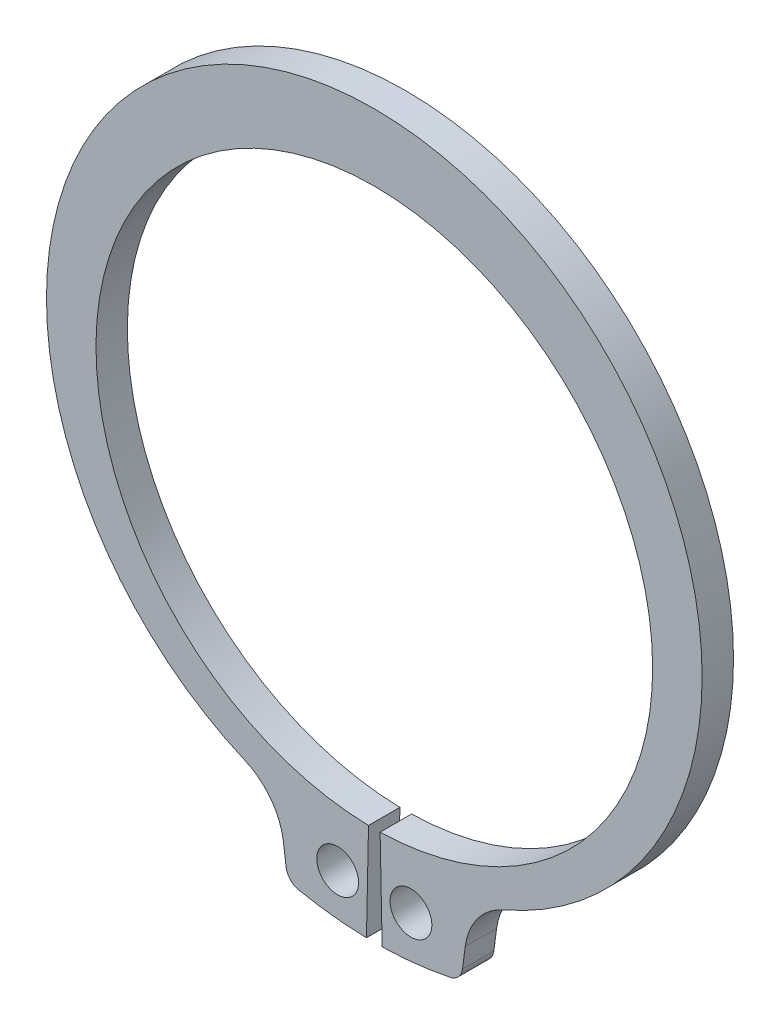
ISO-10303-21;
HEADER;
FILE_DESCRIPTION(('STEP AP214'),'2;1');
FILE_NAME('part.step','',(''),(''),'','','');
FILE_SCHEMA(('AUTOMOTIVE_DESIGN { 1 0 10303 214 1 1 1 1 }'));
ENDSEC;
DATA;
#1=APPLICATION_CONTEXT('core data for automotive mechanical design processes');
#2=APPLICATION_PROTOCOL_DEFINITION('international standard','automotive_design',2000,#1);
#3=PRODUCT_CONTEXT('',#1,'mechanical');
#4=PRODUCT('Part','Part','',(#3));
#5=PRODUCT_RELATED_PRODUCT_CATEGORY('part','',(#4));
#6=PRODUCT_DEFINITION_FORMATION('','',#4);
#7=PRODUCT_DEFINITION_CONTEXT('part definition',#1,'design');
#8=PRODUCT_DEFINITION('design','',#6,#7);
#9=PRODUCT_DEFINITION_SHAPE('','',#8);
#10=(LENGTH_UNIT() NAMED_UNIT(*) SI_UNIT(.MILLI.,.METRE.));
#11=(NAMED_UNIT(*) PLANE_ANGLE_UNIT() SI_UNIT($,.RADIAN.));
#12=(NAMED_UNIT(*) SI_UNIT($,.STERADIAN.) SOLID_ANGLE_UNIT());
#13=UNCERTAINTY_MEASURE_WITH_UNIT(LENGTH_MEASURE(1.E-05),#10,'distance_accuracy_value','');
#14=(GEOMETRIC_REPRESENTATION_CONTEXT(3) GLOBAL_UNCERTAINTY_ASSIGNED_CONTEXT((#13)) GLOBAL_UNIT_ASSIGNED_CONTEXT((#10,
#11,#12)) REPRESENTATION_CONTEXT('',''));
#15=CARTESIAN_POINT('',(0.,0.,0.));
#16=DIRECTION('',(0.,0.,1.));
#17=DIRECTION('',(1.,0.,0.));
#18=AXIS2_PLACEMENT_3D('',#15,#16,#17);
#19=CARTESIAN_POINT('',(0.,0.,-1.5));
#20=DIRECTION('',(0.,0.,1.));
#21=DIRECTION('',(1.,0.,0.));
#22=AXIS2_PLACEMENT_3D('',#19,#20,#21);
#23=CYLINDRICAL_SURFACE('',#22,13.3);
#24=CARTESIAN_POINT('',(0.,0.,0.));
#25=DIRECTION('',(0.,0.,-1.));
#26=DIRECTION('',(1.,0.,0.));
#27=AXIS2_PLACEMENT_3D('',#24,#25,#26);
#28=CIRCLE('',#27,13.3);
#29=CARTESIAN_POINT('',(-0.277083333333333,-13.2971134020279,0.));
#30=VERTEX_POINT('',#29);
#31=CARTESIAN_POINT('',(0.277083333333333,-13.2971134020279,0.));
#32=VERTEX_POINT('',#31);
#33=EDGE_CURVE('E153',#30,#32,#28,.T.);
#34=ORIENTED_EDGE('',*,*,#33,.F.);
#35=DIRECTION('',(0.,0.,1.));
#36=VECTOR('',#35,1.);
#37=CARTESIAN_POINT('',(-0.277083333333333,-13.2971134020279,-1.5));
#38=LINE('',#37,#36);
#39=CARTESIAN_POINT('',(-0.277083333333333,-13.2971134020279,-1.5));
#40=VERTEX_POINT('',#39);
#41=EDGE_CURVE('E11',#40,#30,#38,.T.);
#42=ORIENTED_EDGE('',*,*,#41,.F.);
#43=CARTESIAN_POINT('',(0.,0.,-1.5));
#44=DIRECTION('',(0.,0.,-1.));
#45=DIRECTION('',(1.,0.,0.));
#46=AXIS2_PLACEMENT_3D('',#43,#44,#45);
#47=CIRCLE('',#46,13.3);
#48=CARTESIAN_POINT('',(0.277083333333333,-13.2971134020279,-1.5));
#49=VERTEX_POINT('',#48);
#50=EDGE_CURVE('E186',#40,#49,#47,.T.);
#51=ORIENTED_EDGE('',*,*,#50,.T.);
#52=DIRECTION('',(0.,0.,1.));
#53=VECTOR('',#52,1.);
#54=CARTESIAN_POINT('',(0.277083333333333,-13.2971134020279,-1.5));
#55=LINE('',#54,#53);
#56=EDGE_CURVE('E35',#49,#32,#55,.T.);
#57=ORIENTED_EDGE('',*,*,#56,.T.);
#58=EDGE_LOOP('',(#34,#42,#51,#57));
#59=FACE_BOUND('',#58,.T.);
#60=ADVANCED_FACE('F32',(#59),#23,.F.);
#61=CARTESIAN_POINT('',(-0.277083333333333,-13.2971134020279,-1.5));
#62=DIRECTION('',(0.999782962558486,-0.0208333333333333,0.));
#63=DIRECTION('',(0.0208333333333333,0.999782962558486,0.));
#64=AXIS2_PLACEMENT_3D('',#61,#62,#63);
#65=PLANE('',#64);
#66=DIRECTION('',(0.0208333333333333,0.999782962558486,0.));
#67=VECTOR('',#66,1.);
#68=CARTESIAN_POINT('',(-0.277083333333333,-13.2971134020279,0.));
#69=LINE('',#68,#67);
#70=CARTESIAN_POINT('',(-0.375,-17.9960933260527,0.));
#71=VERTEX_POINT('',#70);
#72=EDGE_CURVE('E184',#71,#30,#69,.T.);
#73=ORIENTED_EDGE('',*,*,#72,.F.);
#74=DIRECTION('',(0.,0.,1.));
#75=VECTOR('',#74,1.);
#76=CARTESIAN_POINT('',(-0.375,-17.9960933260527,-1.5));
#77=LINE('',#76,#75);
#78=CARTESIAN_POINT('',(-0.375,-17.9960933260527,-1.5));
#79=VERTEX_POINT('',#78);
#80=EDGE_CURVE('E41',#79,#71,#77,.T.);
#81=ORIENTED_EDGE('',*,*,#80,.F.);
#82=DIRECTION('',(0.0208333333333333,0.999782962558486,0.));
#83=VECTOR('',#82,1.);
#84=CARTESIAN_POINT('',(-0.277083333333333,-13.2971134020279,-1.5));
#85=LINE('',#84,#83);
#86=EDGE_CURVE('E143',#79,#40,#85,.T.);
#87=ORIENTED_EDGE('',*,*,#86,.T.);
#88=ORIENTED_EDGE('',*,*,#41,.T.);
#89=EDGE_LOOP('',(#73,#81,#87,#88));
#90=FACE_BOUND('',#89,.T.);
#91=ADVANCED_FACE('F206',(#90),#65,.T.);
#92=CARTESIAN_POINT('',(0.,0.,-1.5));
#93=DIRECTION('',(0.,0.,1.));
#94=DIRECTION('',(1.,0.,0.));
#95=AXIS2_PLACEMENT_3D('',#92,#93,#94);
#96=CYLINDRICAL_SURFACE('',#95,18.);
#97=CARTESIAN_POINT('',(0.,0.,0.));
#98=DIRECTION('',(0.,0.,1.));
#99=DIRECTION('',(1.,0.,0.));
#100=AXIS2_PLACEMENT_3D('',#97,#98,#99);
#101=CIRCLE('',#100,18.);
#102=CARTESIAN_POINT('',(-3.62084439856544,-17.6320584686354,0.));
#103=VERTEX_POINT('',#102);
#104=EDGE_CURVE('E130',#103,#71,#101,.T.);
#105=ORIENTED_EDGE('',*,*,#104,.F.);
#106=DIRECTION('',(0.,0.,1.));
#107=VECTOR('',#106,1.);
#108=CARTESIAN_POINT('',(-3.62084439856544,-17.6320584686354,-1.5));
#109=LINE('',#108,#107);
#110=CARTESIAN_POINT('',(-3.62084439856544,-17.6320584686354,-1.5));
#111=VERTEX_POINT('',#110);
#112=EDGE_CURVE('E125',#111,#103,#109,.T.);
#113=ORIENTED_EDGE('',*,*,#112,.F.);
#114=CARTESIAN_POINT('',(0.,0.,-1.5));
#115=DIRECTION('',(0.,0.,1.));
#116=DIRECTION('',(1.,0.,0.));
#117=AXIS2_PLACEMENT_3D('',#114,#115,#116);
#118=CIRCLE('',#117,18.);
#119=EDGE_CURVE('E128',#111,#79,#118,.T.);
#120=ORIENTED_EDGE('',*,*,#119,.T.);
#121=ORIENTED_EDGE('',*,*,#80,.T.);
#122=EDGE_LOOP('',(#105,#113,#120,#121));
#123=FACE_BOUND('',#122,.T.);
#124=ADVANCED_FACE('F127',(#123),#96,.T.);
#125=CARTESIAN_POINT('',(-3.46997588195855,-16.8973893657756,-1.5));
#126=DIRECTION('',(0.,0.,1.));
#127=DIRECTION('',(1.,0.,0.));
#128=AXIS2_PLACEMENT_3D('',#125,#126,#127);
#129=CYLINDRICAL_SURFACE('',#128,0.75);
#130=CARTESIAN_POINT('',(-3.46997588195855,-16.8973893657756,0.));
#131=DIRECTION('',(0.,0.,1.));
#132=DIRECTION('',(1.,0.,0.));
#133=AXIS2_PLACEMENT_3D('',#130,#131,#132);
#134=CIRCLE('',#133,0.75);
#135=CARTESIAN_POINT('',(-4.21355952798891,-16.9952840099406,0.));
#136=VERTEX_POINT('',#135);
#137=EDGE_CURVE('E181',#136,#103,#134,.T.);
#138=ORIENTED_EDGE('',*,*,#137,.F.);
#139=DIRECTION('',(0.,0.,1.));
#140=VECTOR('',#139,1.);
#141=CARTESIAN_POINT('',(-4.21355952798891,-16.9952840099406,-1.5));
#142=LINE('',#141,#140);
#143=CARTESIAN_POINT('',(-4.21355952798891,-16.9952840099406,-1.5));
#144=VERTEX_POINT('',#143);
#145=EDGE_CURVE('E135',#144,#136,#142,.T.);
#146=ORIENTED_EDGE('',*,*,#145,.F.);
#147=CARTESIAN_POINT('',(-3.46997588195855,-16.8973893657756,-1.5));
#148=DIRECTION('',(0.,0.,1.));
#149=DIRECTION('',(1.,0.,0.));
#150=AXIS2_PLACEMENT_3D('',#147,#148,#149);
#151=CIRCLE('',#150,0.75);
#152=EDGE_CURVE('E141',#144,#111,#151,.T.);
#153=ORIENTED_EDGE('',*,*,#152,.T.);
#154=ORIENTED_EDGE('',*,*,#112,.T.);
#155=EDGE_LOOP('',(#138,#146,#153,#154));
#156=FACE_BOUND('',#155,.T.);
#157=ADVANCED_FACE('F145',(#156),#129,.T.);
#158=CARTESIAN_POINT('',(-4.34513661308763,-15.9958568246616,-1.5));
#159=DIRECTION('',(-0.99144486137381,-0.130526192220052,0.));
#160=DIRECTION('',(0.130526192220052,-0.99144486137381,0.));
#161=AXIS2_PLACEMENT_3D('',#158,#159,#160);
#162=PLANE('',#161);
#163=DIRECTION('',(0.130526192220052,-0.99144486137381,0.));
#164=VECTOR('',#163,1.);
#165=CARTESIAN_POINT('',(-4.34513661308763,-15.9958568246616,0.));
#166=LINE('',#165,#164);
#167=CARTESIAN_POINT('',(-4.34513661308763,-15.9958568246616,0.));
#168=VERTEX_POINT('',#167);
#169=EDGE_CURVE('E178',#168,#136,#166,.T.);
#170=ORIENTED_EDGE('',*,*,#169,.F.);
#171=DIRECTION('',(0.,0.,1.));
#172=VECTOR('',#171,1.);
#173=CARTESIAN_POINT('',(-4.34513661308763,-15.9958568246616,-1.5));
#174=LINE('',#173,#172);
#175=CARTESIAN_POINT('',(-4.34513661308763,-15.9958568246616,-1.5));
#176=VERTEX_POINT('',#175);
#177=EDGE_CURVE('E190',#176,#168,#174,.T.);
#178=ORIENTED_EDGE('',*,*,#177,.F.);
#179=DIRECTION('',(0.130526192220052,-0.99144486137381,0.));
#180=VECTOR('',#179,1.);
#181=CARTESIAN_POINT('',(-4.34513661308763,-15.9958568246616,-1.5));
#182=LINE('',#181,#180);
#183=EDGE_CURVE('E146',#176,#144,#182,.T.);
#184=ORIENTED_EDGE('',*,*,#183,.T.);
#185=ORIENTED_EDGE('',*,*,#145,.T.);
#186=EDGE_LOOP('',(#170,#178,#184,#185));
#187=FACE_BOUND('',#186,.T.);
#188=ADVANCED_FACE('F219',(#187),#162,.T.);
#189=CARTESIAN_POINT('',(-7.41799621001931,-16.4004064653331,-1.5));
#190=DIRECTION('',(0.,0.,1.));
#191=DIRECTION('',(1.,0.,0.));
#192=AXIS2_PLACEMENT_3D('',#189,#190,#191);
#193=CYLINDRICAL_SURFACE('',#192,3.09937518126195);
#194=CARTESIAN_POINT('',(-7.41799621001931,-16.4004064653331,0.));
#195=DIRECTION('',(0.,0.,-1.));
#196=DIRECTION('',(1.,0.,0.));
#197=AXIS2_PLACEMENT_3D('',#194,#195,#196);
#198=CIRCLE('',#197,3.09937518126195);
#199=CARTESIAN_POINT('',(-6.19272634443664,-13.5535063492915,0.));
#200=VERTEX_POINT('',#199);
#201=EDGE_CURVE('E175',#200,#168,#198,.T.);
#202=ORIENTED_EDGE('',*,*,#201,.F.);
#203=DIRECTION('',(0.,0.,1.));
#204=VECTOR('',#203,1.);
#205=CARTESIAN_POINT('',(-6.19272634443664,-13.5535063492915,-1.5));
#206=LINE('',#205,#204);
#207=CARTESIAN_POINT('',(-6.19272634443664,-13.5535063492915,-1.5));
#208=VERTEX_POINT('',#207);
#209=EDGE_CURVE('E192',#208,#200,#206,.T.);
#210=ORIENTED_EDGE('',*,*,#209,.F.);
#211=CARTESIAN_POINT('',(-7.41799621001931,-16.4004064653331,-1.5));
#212=DIRECTION('',(0.,0.,-1.));
#213=DIRECTION('',(1.,0.,0.));
#214=AXIS2_PLACEMENT_3D('',#211,#212,#213);
#215=CIRCLE('',#214,3.09937518126195);
#216=EDGE_CURVE('E148',#208,#176,#215,.T.);
#217=ORIENTED_EDGE('',*,*,#216,.T.);
#218=ORIENTED_EDGE('',*,*,#177,.T.);
#219=EDGE_LOOP('',(#202,#210,#217,#218));
#220=FACE_BOUND('',#219,.T.);
#221=ADVANCED_FACE('F222',(#220),#193,.F.);
#222=CARTESIAN_POINT('',(0.,0.835220447810059,-1.5));
#223=DIRECTION('',(0.,0.,1.));
#224=DIRECTION('',(1.,0.,0.));
#225=AXIS2_PLACEMENT_3D('',#222,#223,#224);
#226=CYLINDRICAL_SURFACE('',#225,15.6647795521899);
#227=CARTESIAN_POINT('',(0.,0.835220447810059,0.));
#228=DIRECTION('',(0.,0.,1.));
#229=DIRECTION('',(1.,0.,0.));
#230=AXIS2_PLACEMENT_3D('',#227,#228,#229);
#231=CIRCLE('',#230,15.6647795521899);
#232=CARTESIAN_POINT('',(6.19272634443663,-13.5535063492915,0.));
#233=VERTEX_POINT('',#232);
#234=EDGE_CURVE('E172',#233,#200,#231,.T.);
#235=ORIENTED_EDGE('',*,*,#234,.F.);
#236=DIRECTION('',(0.,0.,1.));
#237=VECTOR('',#236,1.);
#238=CARTESIAN_POINT('',(6.19272634443663,-13.5535063492915,-1.5));
#239=LINE('',#238,#237);
#240=CARTESIAN_POINT('',(6.19272634443663,-13.5535063492915,-1.5));
#241=VERTEX_POINT('',#240);
#242=EDGE_CURVE('E194',#241,#233,#239,.T.);
#243=ORIENTED_EDGE('',*,*,#242,.F.);
#244=CARTESIAN_POINT('',(0.,0.835220447810059,-1.5));
#245=DIRECTION('',(0.,0.,1.));
#246=DIRECTION('',(1.,0.,0.));
#247=AXIS2_PLACEMENT_3D('',#244,#245,#246);
#248=CIRCLE('',#247,15.6647795521899);
#249=EDGE_CURVE('E296',#241,#208,#248,.T.);
#250=ORIENTED_EDGE('',*,*,#249,.T.);
#251=ORIENTED_EDGE('',*,*,#209,.T.);
#252=EDGE_LOOP('',(#235,#243,#250,#251));
#253=FACE_BOUND('',#252,.T.);
#254=ADVANCED_FACE('F226',(#253),#226,.T.);
#255=CARTESIAN_POINT('',(7.41799621001931,-16.4004064653331,-1.5));
#256=DIRECTION('',(0.,0.,1.));
#257=DIRECTION('',(1.,0.,0.));
#258=AXIS2_PLACEMENT_3D('',#255,#256,#257);
#259=CYLINDRICAL_SURFACE('',#258,3.09937518126195);
#260=CARTESIAN_POINT('',(7.41799621001931,-16.4004064653331,0.));
#261=DIRECTION('',(0.,0.,-1.));
#262=DIRECTION('',(1.,0.,0.));
#263=AXIS2_PLACEMENT_3D('',#260,#261,#262);
#264=CIRCLE('',#263,3.09937518126195);
#265=CARTESIAN_POINT('',(4.34513661308763,-15.9958568246616,0.));
#266=VERTEX_POINT('',#265);
#267=EDGE_CURVE('E169',#266,#233,#264,.T.);
#268=ORIENTED_EDGE('',*,*,#267,.F.);
#269=DIRECTION('',(0.,0.,1.));
#270=VECTOR('',#269,1.);
#271=CARTESIAN_POINT('',(4.34513661308763,-15.9958568246616,-1.5));
#272=LINE('',#271,#270);
#273=CARTESIAN_POINT('',(4.34513661308763,-15.9958568246616,-1.5));
#274=VERTEX_POINT('',#273);
#275=EDGE_CURVE('E196',#274,#266,#272,.T.);
#276=ORIENTED_EDGE('',*,*,#275,.F.);
#277=CARTESIAN_POINT('',(7.41799621001931,-16.4004064653331,-1.5));
#278=DIRECTION('',(0.,0.,-1.));
#279=DIRECTION('',(1.,0.,0.));
#280=AXIS2_PLACEMENT_3D('',#277,#278,#279);
#281=CIRCLE('',#280,3.09937518126195);
#282=EDGE_CURVE('E293',#274,#241,#281,.T.);
#283=ORIENTED_EDGE('',*,*,#282,.T.);
#284=ORIENTED_EDGE('',*,*,#242,.T.);
#285=EDGE_LOOP('',(#268,#276,#283,#284));
#286=FACE_BOUND('',#285,.T.);
#287=ADVANCED_FACE('F230',(#286),#259,.F.);
#288=CARTESIAN_POINT('',(4.34513661308763,-15.9958568246616,-1.5));
#289=DIRECTION('',(0.99144486137381,-0.130526192220052,0.));
#290=DIRECTION('',(0.130526192220052,0.99144486137381,0.));
#291=AXIS2_PLACEMENT_3D('',#288,#289,#290);
#292=PLANE('',#291);
#293=DIRECTION('',(0.130526192220052,0.99144486137381,0.));
#294=VECTOR('',#293,1.);
#295=CARTESIAN_POINT('',(4.34513661308763,-15.9958568246616,0.));
#296=LINE('',#295,#294);
#297=CARTESIAN_POINT('',(4.21355952798891,-16.9952840099406,0.));
#298=VERTEX_POINT('',#297);
#299=EDGE_CURVE('E166',#298,#266,#296,.T.);
#300=ORIENTED_EDGE('',*,*,#299,.F.);
#301=DIRECTION('',(0.,0.,1.));
#302=VECTOR('',#301,1.);
#303=CARTESIAN_POINT('',(4.21355952798891,-16.9952840099406,-1.5));
#304=LINE('',#303,#302);
#305=CARTESIAN_POINT('',(4.21355952798891,-16.9952840099406,-1.5));
#306=VERTEX_POINT('',#305);
#307=EDGE_CURVE('E198',#306,#298,#304,.T.);
#308=ORIENTED_EDGE('',*,*,#307,.F.);
#309=DIRECTION('',(0.130526192220052,0.99144486137381,0.));
#310=VECTOR('',#309,1.);
#311=CARTESIAN_POINT('',(4.34513661308763,-15.9958568246616,-1.5));
#312=LINE('',#311,#310);
#313=EDGE_CURVE('E290',#306,#274,#312,.T.);
#314=ORIENTED_EDGE('',*,*,#313,.T.);
#315=ORIENTED_EDGE('',*,*,#275,.T.);
#316=EDGE_LOOP('',(#300,#308,#314,#315));
#317=FACE_BOUND('',#316,.T.);
#318=ADVANCED_FACE('F234',(#317),#292,.T.);
#319=CARTESIAN_POINT('',(3.46997588195855,-16.8973893657756,-1.5));
#320=DIRECTION('',(0.,0.,1.));
#321=DIRECTION('',(1.,0.,0.));
#322=AXIS2_PLACEMENT_3D('',#319,#320,#321);
#323=CYLINDRICAL_SURFACE('',#322,0.75);
#324=CARTESIAN_POINT('',(3.46997588195855,-16.8973893657756,0.));
#325=DIRECTION('',(0.,0.,1.));
#326=DIRECTION('',(-1.,0.,0.));
#327=AXIS2_PLACEMENT_3D('',#324,#325,#326);
#328=CIRCLE('',#327,0.75);
#329=CARTESIAN_POINT('',(3.62084439856544,-17.6320584686354,0.));
#330=VERTEX_POINT('',#329);
#331=EDGE_CURVE('E163',#330,#298,#328,.T.);
#332=ORIENTED_EDGE('',*,*,#331,.F.);
#333=DIRECTION('',(0.,0.,1.));
#334=VECTOR('',#333,1.);
#335=CARTESIAN_POINT('',(3.62084439856544,-17.6320584686354,-1.5));
#336=LINE('',#335,#334);
#337=CARTESIAN_POINT('',(3.62084439856544,-17.6320584686354,-1.5));
#338=VERTEX_POINT('',#337);
#339=EDGE_CURVE('E200',#338,#330,#336,.T.);
#340=ORIENTED_EDGE('',*,*,#339,.F.);
#341=CARTESIAN_POINT('',(3.46997588195855,-16.8973893657756,-1.5));
#342=DIRECTION('',(0.,0.,1.));
#343=DIRECTION('',(-1.,0.,0.));
#344=AXIS2_PLACEMENT_3D('',#341,#342,#343);
#345=CIRCLE('',#344,0.75);
#346=EDGE_CURVE('E287',#338,#306,#345,.T.);
#347=ORIENTED_EDGE('',*,*,#346,.T.);
#348=ORIENTED_EDGE('',*,*,#307,.T.);
#349=EDGE_LOOP('',(#332,#340,#347,#348));
#350=FACE_BOUND('',#349,.T.);
#351=ADVANCED_FACE('F238',(#350),#323,.T.);
#352=CARTESIAN_POINT('',(0.,0.,-1.5));
#353=DIRECTION('',(0.,0.,1.));
#354=DIRECTION('',(1.,0.,0.));
#355=AXIS2_PLACEMENT_3D('',#352,#353,#354);
#356=CYLINDRICAL_SURFACE('',#355,18.);
#357=CARTESIAN_POINT('',(0.,0.,0.));
#358=DIRECTION('',(0.,0.,1.));
#359=DIRECTION('',(1.,0.,0.));
#360=AXIS2_PLACEMENT_3D('',#357,#358,#359);
#361=CIRCLE('',#360,18.);
#362=CARTESIAN_POINT('',(0.374999999999995,-17.9960933260527,0.));
#363=VERTEX_POINT('',#362);
#364=EDGE_CURVE('E160',#363,#330,#361,.T.);
#365=ORIENTED_EDGE('',*,*,#364,.F.);
#366=DIRECTION('',(0.,0.,1.));
#367=VECTOR('',#366,1.);
#368=CARTESIAN_POINT('',(0.374999999999995,-17.9960933260527,-1.5));
#369=LINE('',#368,#367);
#370=CARTESIAN_POINT('',(0.374999999999995,-17.9960933260527,-1.5));
#371=VERTEX_POINT('',#370);
#372=EDGE_CURVE('E201',#371,#363,#369,.T.);
#373=ORIENTED_EDGE('',*,*,#372,.F.);
#374=CARTESIAN_POINT('',(0.,0.,-1.5));
#375=DIRECTION('',(0.,0.,1.));
#376=DIRECTION('',(1.,0.,0.));
#377=AXIS2_PLACEMENT_3D('',#374,#375,#376);
#378=CIRCLE('',#377,18.);
#379=EDGE_CURVE('E284',#371,#338,#378,.T.);
#380=ORIENTED_EDGE('',*,*,#379,.T.);
#381=ORIENTED_EDGE('',*,*,#339,.T.);
#382=EDGE_LOOP('',(#365,#373,#380,#381));
#383=FACE_BOUND('',#382,.T.);
#384=ADVANCED_FACE('F242',(#383),#356,.T.);
#385=CARTESIAN_POINT('',(0.277083333333333,-13.2971134020279,-1.5));
#386=DIRECTION('',(-0.999782962558486,-0.0208333333333333,0.));
#387=DIRECTION('',(0.0208333333333333,-0.999782962558486,0.));
#388=AXIS2_PLACEMENT_3D('',#385,#386,#387);
#389=PLANE('',#388);
#390=DIRECTION('',(0.0208333333333333,-0.999782962558486,0.));
#391=VECTOR('',#390,1.);
#392=CARTESIAN_POINT('',(0.277083333333333,-13.2971134020279,0.));
#393=LINE('',#392,#391);
#394=EDGE_CURVE('E156',#32,#363,#393,.T.);
#395=ORIENTED_EDGE('',*,*,#394,.F.);
#396=ORIENTED_EDGE('',*,*,#56,.F.);
#397=DIRECTION('',(0.0208333333333333,-0.999782962558486,0.));
#398=VECTOR('',#397,1.);
#399=CARTESIAN_POINT('',(0.277083333333333,-13.2971134020279,-1.5));
#400=LINE('',#399,#398);
#401=EDGE_CURVE('E282',#49,#371,#400,.T.);
#402=ORIENTED_EDGE('',*,*,#401,.T.);
#403=ORIENTED_EDGE('',*,*,#372,.T.);
#404=EDGE_LOOP('',(#395,#396,#402,#403));
#405=FACE_BOUND('',#404,.T.);
#406=ADVANCED_FACE('F203',(#405),#389,.T.);
#407=CARTESIAN_POINT('',(0.,0.,-1.5));
#408=DIRECTION('',(0.,0.,1.));
#409=DIRECTION('',(1.,0.,0.));
#410=AXIS2_PLACEMENT_3D('',#407,#408,#409);
#411=PLANE('',#410);
#412=CARTESIAN_POINT('',(-1.75,-15.9040089285689,-1.5));
#413=DIRECTION('',(0.,0.,1.));
#414=DIRECTION('',(1.,0.,0.));
#415=AXIS2_PLACEMENT_3D('',#412,#413,#414);
#416=CIRCLE('',#415,1.);
#417=CARTESIAN_POINT('',(-0.749999999999999,-15.9040089285689,-1.5));
#418=VERTEX_POINT('',#417);
#419=EDGE_CURVE('E269',#418,#418,#416,.T.);
#420=ORIENTED_EDGE('',*,*,#419,.T.);
#421=EDGE_LOOP('',(#420));
#422=FACE_BOUND('',#421,.T.);
#423=CARTESIAN_POINT('',(1.75,-15.9040089285689,-1.5));
#424=DIRECTION('',(0.,0.,1.));
#425=DIRECTION('',(1.,0.,0.));
#426=AXIS2_PLACEMENT_3D('',#423,#424,#425);
#427=CIRCLE('',#426,1.);
#428=CARTESIAN_POINT('',(2.75,-15.9040089285689,-1.5));
#429=VERTEX_POINT('',#428);
#430=EDGE_CURVE('E157',#429,#429,#427,.T.);
#431=ORIENTED_EDGE('',*,*,#430,.T.);
#432=EDGE_LOOP('',(#431));
#433=FACE_BOUND('',#432,.T.);
#434=ORIENTED_EDGE('',*,*,#50,.F.);
#435=ORIENTED_EDGE('',*,*,#86,.F.);
#436=ORIENTED_EDGE('',*,*,#119,.F.);
#437=ORIENTED_EDGE('',*,*,#152,.F.);
#438=ORIENTED_EDGE('',*,*,#183,.F.);
#439=ORIENTED_EDGE('',*,*,#216,.F.);
#440=ORIENTED_EDGE('',*,*,#249,.F.);
#441=ORIENTED_EDGE('',*,*,#282,.F.);
#442=ORIENTED_EDGE('',*,*,#313,.F.);
#443=ORIENTED_EDGE('',*,*,#346,.F.);
#444=ORIENTED_EDGE('',*,*,#379,.F.);
#445=ORIENTED_EDGE('',*,*,#401,.F.);
#446=EDGE_LOOP('',(#434,#435,#436,#437,#438,#439,#440,#441,#442,#443,#444,#445));
#447=FACE_BOUND('',#446,.T.);
#448=ADVANCED_FACE('F139',(#422,#433,#447),#411,.F.);
#449=CARTESIAN_POINT('',(0.,0.,0.));
#450=DIRECTION('',(0.,0.,1.));
#451=DIRECTION('',(1.,0.,0.));
#452=AXIS2_PLACEMENT_3D('',#449,#450,#451);
#453=PLANE('',#452);
#454=CARTESIAN_POINT('',(-1.75,-15.9040089285689,0.));
#455=DIRECTION('',(0.,0.,1.));
#456=DIRECTION('',(1.,0.,0.));
#457=AXIS2_PLACEMENT_3D('',#454,#455,#456);
#458=CIRCLE('',#457,1.);
#459=CARTESIAN_POINT('',(-0.749999999999999,-15.9040089285689,0.));
#460=VERTEX_POINT('',#459);
#461=EDGE_CURVE('E272',#460,#460,#458,.T.);
#462=ORIENTED_EDGE('',*,*,#461,.F.);
#463=EDGE_LOOP('',(#462));
#464=FACE_BOUND('',#463,.T.);
#465=CARTESIAN_POINT('',(1.75,-15.9040089285689,0.));
#466=DIRECTION('',(0.,0.,1.));
#467=DIRECTION('',(1.,0.,0.));
#468=AXIS2_PLACEMENT_3D('',#465,#466,#467);
#469=CIRCLE('',#468,1.);
#470=CARTESIAN_POINT('',(2.75,-15.9040089285689,0.));
#471=VERTEX_POINT('',#470);
#472=EDGE_CURVE('E274',#471,#471,#469,.T.);
#473=ORIENTED_EDGE('',*,*,#472,.F.);
#474=EDGE_LOOP('',(#473));
#475=FACE_BOUND('',#474,.T.);
#476=ORIENTED_EDGE('',*,*,#33,.T.);
#477=ORIENTED_EDGE('',*,*,#394,.T.);
#478=ORIENTED_EDGE('',*,*,#364,.T.);
#479=ORIENTED_EDGE('',*,*,#331,.T.);
#480=ORIENTED_EDGE('',*,*,#299,.T.);
#481=ORIENTED_EDGE('',*,*,#267,.T.);
#482=ORIENTED_EDGE('',*,*,#234,.T.);
#483=ORIENTED_EDGE('',*,*,#201,.T.);
#484=ORIENTED_EDGE('',*,*,#169,.T.);
#485=ORIENTED_EDGE('',*,*,#137,.T.);
#486=ORIENTED_EDGE('',*,*,#104,.T.);
#487=ORIENTED_EDGE('',*,*,#72,.T.);
#488=EDGE_LOOP('',(#476,#477,#478,#479,#480,#481,#482,#483,#484,#485,#486,#487));
#489=FACE_BOUND('',#488,.T.);
#490=ADVANCED_FACE('F205',(#464,#475,#489),#453,.T.);
#491=CARTESIAN_POINT('',(1.75,-15.9040089285689,-1.5));
#492=DIRECTION('',(0.,0.,1.));
#493=DIRECTION('',(1.,0.,0.));
#494=AXIS2_PLACEMENT_3D('',#491,#492,#493);
#495=CYLINDRICAL_SURFACE('',#494,1.);
#496=ORIENTED_EDGE('',*,*,#430,.F.);
#497=EDGE_LOOP('',(#496));
#498=FACE_BOUND('',#497,.T.);
#499=ORIENTED_EDGE('',*,*,#472,.T.);
#500=EDGE_LOOP('',(#499));
#501=FACE_BOUND('',#500,.T.);
#502=ADVANCED_FACE('F254',(#498,#501),#495,.F.);
#503=CARTESIAN_POINT('',(-1.75,-15.9040089285689,-1.5));
#504=DIRECTION('',(0.,0.,1.));
#505=DIRECTION('',(1.,0.,0.));
#506=AXIS2_PLACEMENT_3D('',#503,#504,#505);
#507=CYLINDRICAL_SURFACE('',#506,1.);
#508=ORIENTED_EDGE('',*,*,#419,.F.);
#509=EDGE_LOOP('',(#508));
#510=FACE_BOUND('',#509,.T.);
#511=ORIENTED_EDGE('',*,*,#461,.T.);
#512=EDGE_LOOP('',(#511));
#513=FACE_BOUND('',#512,.T.);
#514=ADVANCED_FACE('F261',(#510,#513),#507,.F.);
#515=CLOSED_SHELL('',(#60,#91,#124,#157,#188,#221,#254,#287,#318,#351,#384,#406,#448,#490,#502,#514));
#516=MANIFOLD_SOLID_BREP('B2',#515);
#517=ADVANCED_BREP_SHAPE_REPRESENTATION('',(#18,#516),#14);
#518=SHAPE_DEFINITION_REPRESENTATION(#9,#517);
ENDSEC;
END-ISO-10303-21;
